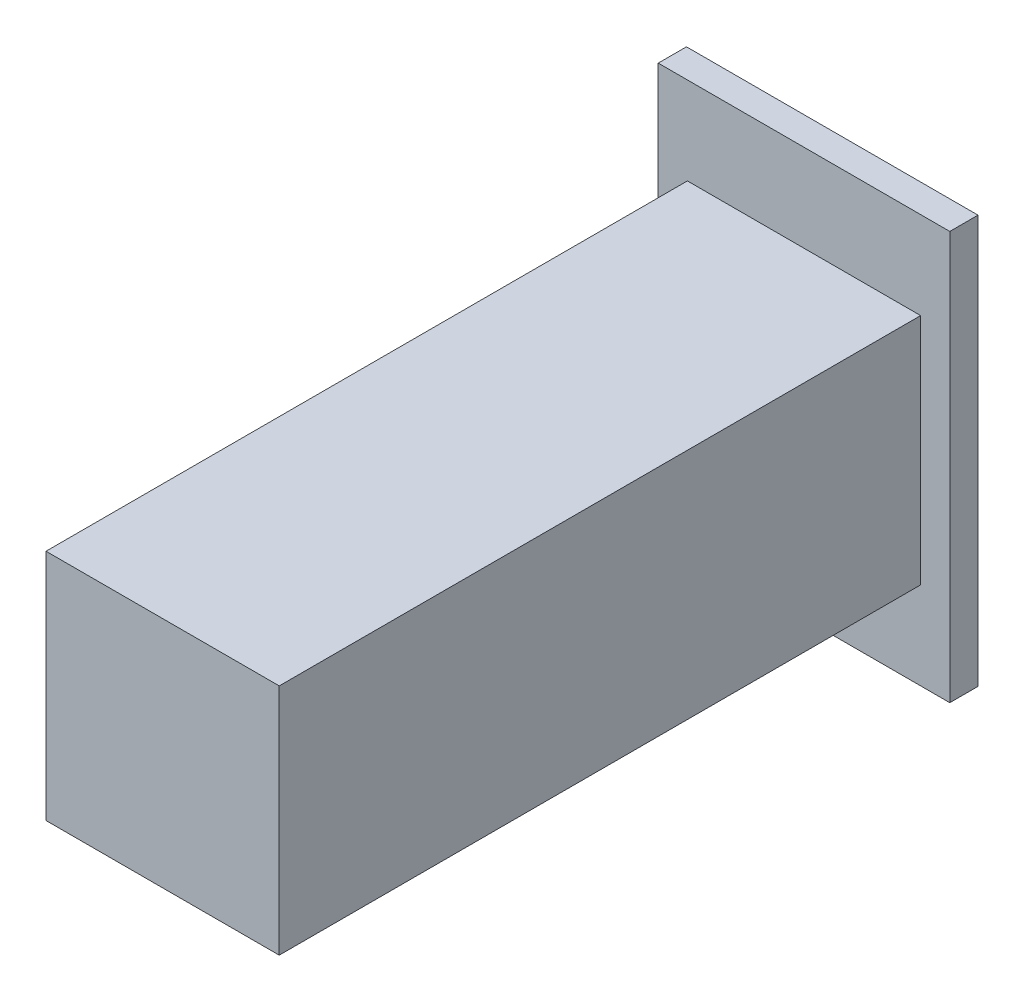
ISO-10303-21;
HEADER;
FILE_DESCRIPTION(('STEP AP214'),'2;1');
FILE_NAME('part.step','',(''),(''),'','','');
FILE_SCHEMA(('AUTOMOTIVE_DESIGN { 1 0 10303 214 1 1 1 1 }'));
ENDSEC;
DATA;
#1=APPLICATION_CONTEXT('core data for automotive mechanical design processes');
#2=APPLICATION_PROTOCOL_DEFINITION('international standard','automotive_design',2000,#1);
#3=PRODUCT_CONTEXT('',#1,'mechanical');
#4=PRODUCT('Part','Part','',(#3));
#5=PRODUCT_RELATED_PRODUCT_CATEGORY('part','',(#4));
#6=PRODUCT_DEFINITION_FORMATION('','',#4);
#7=PRODUCT_DEFINITION_CONTEXT('part definition',#1,'design');
#8=PRODUCT_DEFINITION('design','',#6,#7);
#9=PRODUCT_DEFINITION_SHAPE('','',#8);
#10=(LENGTH_UNIT() NAMED_UNIT(*) SI_UNIT(.MILLI.,.METRE.));
#11=(NAMED_UNIT(*) PLANE_ANGLE_UNIT() SI_UNIT($,.RADIAN.));
#12=(NAMED_UNIT(*) SI_UNIT($,.STERADIAN.) SOLID_ANGLE_UNIT());
#13=UNCERTAINTY_MEASURE_WITH_UNIT(LENGTH_MEASURE(1.E-05),#10,'distance_accuracy_value','');
#14=(GEOMETRIC_REPRESENTATION_CONTEXT(3) GLOBAL_UNCERTAINTY_ASSIGNED_CONTEXT((#13)) GLOBAL_UNIT_ASSIGNED_CONTEXT((#10,
#11,#12)) REPRESENTATION_CONTEXT('',''));
#15=CARTESIAN_POINT('',(0.,0.,0.));
#16=DIRECTION('',(0.,0.,1.));
#17=DIRECTION('',(1.,0.,0.));
#18=AXIS2_PLACEMENT_3D('',#15,#16,#17);
#19=CARTESIAN_POINT('',(0.,0.,2.42));
#20=DIRECTION('',(0.,0.,1.));
#21=DIRECTION('',(1.,0.,0.));
#22=AXIS2_PLACEMENT_3D('',#19,#20,#21);
#23=PLANE('',#22);
#24=DIRECTION('',(0.,-1.,0.));
#25=VECTOR('',#24,1.);
#26=CARTESIAN_POINT('',(-12.5,-17.5,2.42));
#27=LINE('',#26,#25);
#28=CARTESIAN_POINT('',(-12.5,17.5,2.42));
#29=VERTEX_POINT('',#28);
#30=CARTESIAN_POINT('',(-12.5,-17.5,2.42));
#31=VERTEX_POINT('',#30);
#32=EDGE_CURVE('E148',#29,#31,#27,.T.);
#33=ORIENTED_EDGE('',*,*,#32,.T.);
#34=DIRECTION('',(1.,0.,0.));
#35=VECTOR('',#34,1.);
#36=CARTESIAN_POINT('',(12.5,-17.5,2.42));
#37=LINE('',#36,#35);
#38=CARTESIAN_POINT('',(12.5,-17.5,2.42));
#39=VERTEX_POINT('',#38);
#40=EDGE_CURVE('E85',#31,#39,#37,.T.);
#41=ORIENTED_EDGE('',*,*,#40,.T.);
#42=DIRECTION('',(0.,1.,0.));
#43=VECTOR('',#42,1.);
#44=CARTESIAN_POINT('',(12.5,-17.5,2.42));
#45=LINE('',#44,#43);
#46=CARTESIAN_POINT('',(12.5,17.5,2.42));
#47=VERTEX_POINT('',#46);
#48=EDGE_CURVE('E151',#39,#47,#45,.T.);
#49=ORIENTED_EDGE('',*,*,#48,.T.);
#50=DIRECTION('',(-1.,0.,0.));
#51=VECTOR('',#50,1.);
#52=CARTESIAN_POINT('',(12.5,17.5,2.42));
#53=LINE('',#52,#51);
#54=EDGE_CURVE('E57',#47,#29,#53,.T.);
#55=ORIENTED_EDGE('',*,*,#54,.T.);
#56=EDGE_LOOP('',(#33,#41,#49,#55));
#57=FACE_BOUND('',#56,.T.);
#58=DIRECTION('',(1.,0.,0.));
#59=VECTOR('',#58,1.);
#60=CARTESIAN_POINT('',(10.,-10.,2.42));
#61=LINE('',#60,#59);
#62=CARTESIAN_POINT('',(-10.,-10.,2.42));
#63=VERTEX_POINT('',#62);
#64=CARTESIAN_POINT('',(10.,-10.,2.42));
#65=VERTEX_POINT('',#64);
#66=EDGE_CURVE('E142',#63,#65,#61,.T.);
#67=ORIENTED_EDGE('',*,*,#66,.F.);
#68=DIRECTION('',(0.,-1.,0.));
#69=VECTOR('',#68,1.);
#70=CARTESIAN_POINT('',(-10.,-10.,2.42));
#71=LINE('',#70,#69);
#72=CARTESIAN_POINT('',(-10.,9.99999999999999,2.42000000000001));
#73=VERTEX_POINT('',#72);
#74=EDGE_CURVE('E113',#73,#63,#71,.T.);
#75=ORIENTED_EDGE('',*,*,#74,.F.);
#76=DIRECTION('',(-1.,0.,0.));
#77=VECTOR('',#76,1.);
#78=CARTESIAN_POINT('',(10.,10.,2.42));
#79=LINE('',#78,#77);
#80=CARTESIAN_POINT('',(10.,10.,2.42));
#81=VERTEX_POINT('',#80);
#82=EDGE_CURVE('E48',#81,#73,#79,.T.);
#83=ORIENTED_EDGE('',*,*,#82,.F.);
#84=DIRECTION('',(0.,1.,0.));
#85=VECTOR('',#84,1.);
#86=CARTESIAN_POINT('',(10.,-10.,2.42));
#87=LINE('',#86,#85);
#88=EDGE_CURVE('E144',#65,#81,#87,.T.);
#89=ORIENTED_EDGE('',*,*,#88,.F.);
#90=EDGE_LOOP('',(#67,#75,#83,#89));
#91=FACE_BOUND('',#90,.T.);
#92=ADVANCED_FACE('F33',(#57,#91),#23,.T.);
#93=CARTESIAN_POINT('',(0.,0.,0.));
#94=DIRECTION('',(0.,0.,1.));
#95=DIRECTION('',(1.,0.,0.));
#96=AXIS2_PLACEMENT_3D('',#93,#94,#95);
#97=PLANE('',#96);
#98=DIRECTION('',(0.,-1.,0.));
#99=VECTOR('',#98,1.);
#100=CARTESIAN_POINT('',(-12.5,-17.5,0.));
#101=LINE('',#100,#99);
#102=CARTESIAN_POINT('',(-12.5,17.5,0.));
#103=VERTEX_POINT('',#102);
#104=CARTESIAN_POINT('',(-12.5,-17.5,0.));
#105=VERTEX_POINT('',#104);
#106=EDGE_CURVE('E147',#103,#105,#101,.T.);
#107=ORIENTED_EDGE('',*,*,#106,.F.);
#108=DIRECTION('',(-1.,0.,0.));
#109=VECTOR('',#108,1.);
#110=CARTESIAN_POINT('',(12.5,17.5,0.));
#111=LINE('',#110,#109);
#112=CARTESIAN_POINT('',(12.5,17.5,0.));
#113=VERTEX_POINT('',#112);
#114=EDGE_CURVE('E78',#113,#103,#111,.T.);
#115=ORIENTED_EDGE('',*,*,#114,.F.);
#116=DIRECTION('',(0.,1.,0.));
#117=VECTOR('',#116,1.);
#118=CARTESIAN_POINT('',(12.5,-17.5,0.));
#119=LINE('',#118,#117);
#120=CARTESIAN_POINT('',(12.5,-17.5,0.));
#121=VERTEX_POINT('',#120);
#122=EDGE_CURVE('E159',#121,#113,#119,.T.);
#123=ORIENTED_EDGE('',*,*,#122,.F.);
#124=DIRECTION('',(1.,0.,0.));
#125=VECTOR('',#124,1.);
#126=CARTESIAN_POINT('',(12.5,-17.5,0.));
#127=LINE('',#126,#125);
#128=EDGE_CURVE('E157',#105,#121,#127,.T.);
#129=ORIENTED_EDGE('',*,*,#128,.F.);
#130=EDGE_LOOP('',(#107,#115,#123,#129));
#131=FACE_BOUND('',#130,.T.);
#132=ADVANCED_FACE('F172',(#131),#97,.F.);
#133=CARTESIAN_POINT('',(-12.5,-17.5,2.42));
#134=DIRECTION('',(1.,0.,0.));
#135=DIRECTION('',(0.,0.,-1.));
#136=AXIS2_PLACEMENT_3D('',#133,#134,#135);
#137=PLANE('',#136);
#138=ORIENTED_EDGE('',*,*,#106,.T.);
#139=DIRECTION('',(0.,0.,-1.));
#140=VECTOR('',#139,1.);
#141=CARTESIAN_POINT('',(-12.5,-17.5,2.42));
#142=LINE('',#141,#140);
#143=EDGE_CURVE('E11',#31,#105,#142,.T.);
#144=ORIENTED_EDGE('',*,*,#143,.F.);
#145=ORIENTED_EDGE('',*,*,#32,.F.);
#146=DIRECTION('',(0.,0.,-1.));
#147=VECTOR('',#146,1.);
#148=CARTESIAN_POINT('',(-12.5,17.5,2.42));
#149=LINE('',#148,#147);
#150=EDGE_CURVE('E154',#29,#103,#149,.T.);
#151=ORIENTED_EDGE('',*,*,#150,.T.);
#152=EDGE_LOOP('',(#138,#144,#145,#151));
#153=FACE_BOUND('',#152,.T.);
#154=ADVANCED_FACE('F35',(#153),#137,.F.);
#155=CARTESIAN_POINT('',(12.5,-17.5,2.42));
#156=DIRECTION('',(0.,1.,0.));
#157=DIRECTION('',(0.,0.,1.));
#158=AXIS2_PLACEMENT_3D('',#155,#156,#157);
#159=PLANE('',#158);
#160=ORIENTED_EDGE('',*,*,#128,.T.);
#161=DIRECTION('',(0.,0.,-1.));
#162=VECTOR('',#161,1.);
#163=CARTESIAN_POINT('',(12.5,-17.5,2.42));
#164=LINE('',#163,#162);
#165=EDGE_CURVE('E41',#39,#121,#164,.T.);
#166=ORIENTED_EDGE('',*,*,#165,.F.);
#167=ORIENTED_EDGE('',*,*,#40,.F.);
#168=ORIENTED_EDGE('',*,*,#143,.T.);
#169=EDGE_LOOP('',(#160,#166,#167,#168));
#170=FACE_BOUND('',#169,.T.);
#171=ADVANCED_FACE('F184',(#170),#159,.F.);
#172=CARTESIAN_POINT('',(12.5,-17.5,2.42));
#173=DIRECTION('',(-1.,0.,0.));
#174=DIRECTION('',(0.,0.,1.));
#175=AXIS2_PLACEMENT_3D('',#172,#173,#174);
#176=PLANE('',#175);
#177=ORIENTED_EDGE('',*,*,#122,.T.);
#178=DIRECTION('',(0.,0.,-1.));
#179=VECTOR('',#178,1.);
#180=CARTESIAN_POINT('',(12.5,17.5,2.42));
#181=LINE('',#180,#179);
#182=EDGE_CURVE('E163',#47,#113,#181,.T.);
#183=ORIENTED_EDGE('',*,*,#182,.F.);
#184=ORIENTED_EDGE('',*,*,#48,.F.);
#185=ORIENTED_EDGE('',*,*,#165,.T.);
#186=EDGE_LOOP('',(#177,#183,#184,#185));
#187=FACE_BOUND('',#186,.T.);
#188=ADVANCED_FACE('F168',(#187),#176,.F.);
#189=CARTESIAN_POINT('',(12.5,17.5,2.42));
#190=DIRECTION('',(0.,-1.,0.));
#191=DIRECTION('',(1.,0.,0.));
#192=AXIS2_PLACEMENT_3D('',#189,#190,#191);
#193=PLANE('',#192);
#194=ORIENTED_EDGE('',*,*,#114,.T.);
#195=ORIENTED_EDGE('',*,*,#150,.F.);
#196=ORIENTED_EDGE('',*,*,#54,.F.);
#197=ORIENTED_EDGE('',*,*,#182,.T.);
#198=EDGE_LOOP('',(#194,#195,#196,#197));
#199=FACE_BOUND('',#198,.T.);
#200=ADVANCED_FACE('F176',(#199),#193,.F.);
#201=CARTESIAN_POINT('',(-10.,0.,57.42));
#202=DIRECTION('',(-1.,0.,0.));
#203=DIRECTION('',(0.,-1.,0.));
#204=AXIS2_PLACEMENT_3D('',#201,#202,#203);
#205=PLANE('',#204);
#206=DIRECTION('',(0.,0.,-1.));
#207=VECTOR('',#206,1.);
#208=CARTESIAN_POINT('',(-10.,9.99999999999999,57.42));
#209=LINE('',#208,#207);
#210=CARTESIAN_POINT('',(-10.,9.99999999999999,57.42));
#211=VERTEX_POINT('',#210);
#212=EDGE_CURVE('E135',#211,#73,#209,.T.);
#213=ORIENTED_EDGE('',*,*,#212,.T.);
#214=ORIENTED_EDGE('',*,*,#74,.T.);
#215=DIRECTION('',(0.,0.,-1.));
#216=VECTOR('',#215,1.);
#217=CARTESIAN_POINT('',(-10.,-10.,57.42));
#218=LINE('',#217,#216);
#219=CARTESIAN_POINT('',(-10.,-10.,57.42));
#220=VERTEX_POINT('',#219);
#221=EDGE_CURVE('E108',#220,#63,#218,.T.);
#222=ORIENTED_EDGE('',*,*,#221,.F.);
#223=DIRECTION('',(0.,1.,0.));
#224=VECTOR('',#223,1.);
#225=CARTESIAN_POINT('',(-10.,0.,57.42));
#226=LINE('',#225,#224);
#227=EDGE_CURVE('E112',#220,#211,#226,.T.);
#228=ORIENTED_EDGE('',*,*,#227,.T.);
#229=EDGE_LOOP('',(#213,#214,#222,#228));
#230=FACE_BOUND('',#229,.T.);
#231=ADVANCED_FACE('F111',(#230),#205,.T.);
#232=CARTESIAN_POINT('',(0.,-10.,57.42));
#233=DIRECTION('',(0.,-1.,0.));
#234=DIRECTION('',(0.,0.,-1.));
#235=AXIS2_PLACEMENT_3D('',#232,#233,#234);
#236=PLANE('',#235);
#237=ORIENTED_EDGE('',*,*,#221,.T.);
#238=ORIENTED_EDGE('',*,*,#66,.T.);
#239=DIRECTION('',(0.,0.,-1.));
#240=VECTOR('',#239,1.);
#241=CARTESIAN_POINT('',(10.,-10.,57.42));
#242=LINE('',#241,#240);
#243=CARTESIAN_POINT('',(10.,-10.,57.42));
#244=VERTEX_POINT('',#243);
#245=EDGE_CURVE('E117',#244,#65,#242,.T.);
#246=ORIENTED_EDGE('',*,*,#245,.F.);
#247=DIRECTION('',(-1.,0.,0.));
#248=VECTOR('',#247,1.);
#249=CARTESIAN_POINT('',(0.,-10.,57.42));
#250=LINE('',#249,#248);
#251=EDGE_CURVE('E122',#244,#220,#250,.T.);
#252=ORIENTED_EDGE('',*,*,#251,.T.);
#253=EDGE_LOOP('',(#237,#238,#246,#252));
#254=FACE_BOUND('',#253,.T.);
#255=ADVANCED_FACE('F127',(#254),#236,.T.);
#256=CARTESIAN_POINT('',(10.,0.,57.42));
#257=DIRECTION('',(-1.,0.,0.));
#258=DIRECTION('',(0.,0.,1.));
#259=AXIS2_PLACEMENT_3D('',#256,#257,#258);
#260=PLANE('',#259);
#261=ORIENTED_EDGE('',*,*,#88,.T.);
#262=DIRECTION('',(0.,0.,-1.));
#263=VECTOR('',#262,1.);
#264=CARTESIAN_POINT('',(10.,10.,57.42));
#265=LINE('',#264,#263);
#266=CARTESIAN_POINT('',(10.,10.,57.42));
#267=VERTEX_POINT('',#266);
#268=EDGE_CURVE('E137',#267,#81,#265,.T.);
#269=ORIENTED_EDGE('',*,*,#268,.F.);
#270=DIRECTION('',(0.,1.,0.));
#271=VECTOR('',#270,1.);
#272=CARTESIAN_POINT('',(10.,0.,57.42));
#273=LINE('',#272,#271);
#274=EDGE_CURVE('E130',#244,#267,#273,.T.);
#275=ORIENTED_EDGE('',*,*,#274,.F.);
#276=ORIENTED_EDGE('',*,*,#245,.T.);
#277=EDGE_LOOP('',(#261,#269,#275,#276));
#278=FACE_BOUND('',#277,.T.);
#279=ADVANCED_FACE('F195',(#278),#260,.F.);
#280=CARTESIAN_POINT('',(0.,10.,57.42));
#281=DIRECTION('',(0.,-1.,0.));
#282=DIRECTION('',(1.,0.,0.));
#283=AXIS2_PLACEMENT_3D('',#280,#281,#282);
#284=PLANE('',#283);
#285=ORIENTED_EDGE('',*,*,#82,.T.);
#286=ORIENTED_EDGE('',*,*,#212,.F.);
#287=DIRECTION('',(-1.,0.,0.));
#288=VECTOR('',#287,1.);
#289=CARTESIAN_POINT('',(0.,10.,57.42));
#290=LINE('',#289,#288);
#291=EDGE_CURVE('E124',#267,#211,#290,.T.);
#292=ORIENTED_EDGE('',*,*,#291,.F.);
#293=ORIENTED_EDGE('',*,*,#268,.T.);
#294=EDGE_LOOP('',(#285,#286,#292,#293));
#295=FACE_BOUND('',#294,.T.);
#296=ADVANCED_FACE('F198',(#295),#284,.F.);
#297=CARTESIAN_POINT('',(0.,0.,57.42));
#298=DIRECTION('',(0.,0.,1.));
#299=DIRECTION('',(1.,0.,0.));
#300=AXIS2_PLACEMENT_3D('',#297,#298,#299);
#301=PLANE('',#300);
#302=ORIENTED_EDGE('',*,*,#227,.F.);
#303=ORIENTED_EDGE('',*,*,#251,.F.);
#304=ORIENTED_EDGE('',*,*,#274,.T.);
#305=ORIENTED_EDGE('',*,*,#291,.T.);
#306=EDGE_LOOP('',(#302,#303,#304,#305));
#307=FACE_BOUND('',#306,.T.);
#308=ADVANCED_FACE('F121',(#307),#301,.T.);
#309=CLOSED_SHELL('',(#92,#132,#154,#171,#188,#200,#231,#255,#279,#296,#308));
#310=MANIFOLD_SOLID_BREP('B2',#309);
#311=ADVANCED_BREP_SHAPE_REPRESENTATION('',(#18,#310),#14);
#312=SHAPE_DEFINITION_REPRESENTATION(#9,#311);
ENDSEC;
END-ISO-10303-21;
